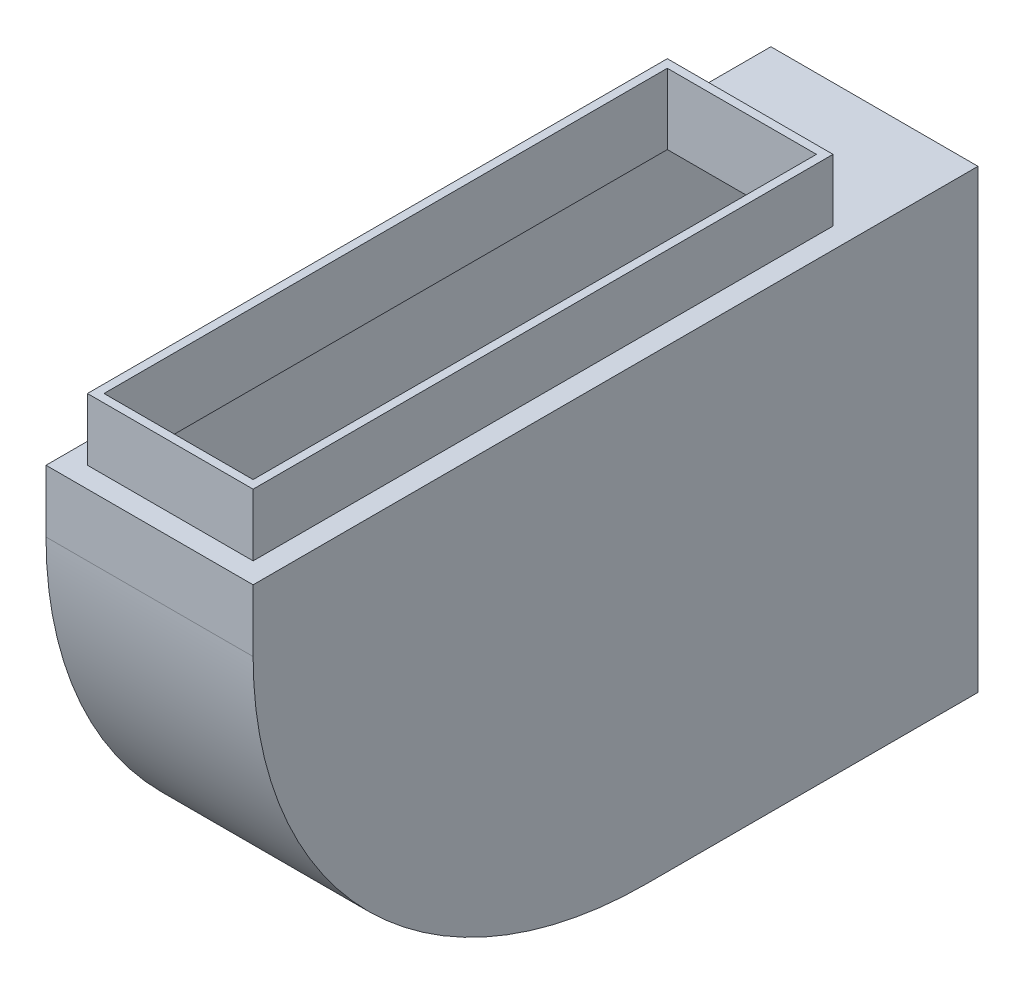
ISO-10303-21;
HEADER;
FILE_DESCRIPTION(('STEP AP214'),'2;1');
FILE_NAME('part.step','',(''),(''),'','','');
FILE_SCHEMA(('AUTOMOTIVE_DESIGN { 1 0 10303 214 1 1 1 1 }'));
ENDSEC;
DATA;
#1=APPLICATION_CONTEXT('core data for automotive mechanical design processes');
#2=APPLICATION_PROTOCOL_DEFINITION('international standard','automotive_design',2000,#1);
#3=PRODUCT_CONTEXT('',#1,'mechanical');
#4=PRODUCT('Part','Part','',(#3));
#5=PRODUCT_RELATED_PRODUCT_CATEGORY('part','',(#4));
#6=PRODUCT_DEFINITION_FORMATION('','',#4);
#7=PRODUCT_DEFINITION_CONTEXT('part definition',#1,'design');
#8=PRODUCT_DEFINITION('design','',#6,#7);
#9=PRODUCT_DEFINITION_SHAPE('','',#8);
#10=(LENGTH_UNIT() NAMED_UNIT(*) SI_UNIT(.MILLI.,.METRE.));
#11=(NAMED_UNIT(*) PLANE_ANGLE_UNIT() SI_UNIT($,.RADIAN.));
#12=(NAMED_UNIT(*) SI_UNIT($,.STERADIAN.) SOLID_ANGLE_UNIT());
#13=UNCERTAINTY_MEASURE_WITH_UNIT(LENGTH_MEASURE(1.E-05),#10,'distance_accuracy_value','');
#14=(GEOMETRIC_REPRESENTATION_CONTEXT(3) GLOBAL_UNCERTAINTY_ASSIGNED_CONTEXT((#13)) GLOBAL_UNIT_ASSIGNED_CONTEXT((#10,
#11,#12)) REPRESENTATION_CONTEXT('',''));
#15=CARTESIAN_POINT('',(0.,0.,0.));
#16=DIRECTION('',(0.,0.,1.));
#17=DIRECTION('',(1.,0.,0.));
#18=AXIS2_PLACEMENT_3D('',#15,#16,#17);
#19=CARTESIAN_POINT('',(0.,3.,0.));
#20=DIRECTION('',(0.,-1.,0.));
#21=DIRECTION('',(0.,0.,-1.));
#22=AXIS2_PLACEMENT_3D('',#19,#20,#21);
#23=PLANE('',#22);
#24=DIRECTION('',(0.,0.,-1.));
#25=VECTOR('',#24,1.);
#26=CARTESIAN_POINT('',(4.,3.,14.));
#27=LINE('',#26,#25);
#28=CARTESIAN_POINT('',(4.,3.,14.));
#29=VERTEX_POINT('',#28);
#30=CARTESIAN_POINT('',(4.,3.,-14.));
#31=VERTEX_POINT('',#30);
#32=EDGE_CURVE('E416',#29,#31,#27,.T.);
#33=ORIENTED_EDGE('',*,*,#32,.T.);
#34=DIRECTION('',(-1.,0.,0.));
#35=VECTOR('',#34,1.);
#36=CARTESIAN_POINT('',(-4.,3.,-14.));
#37=LINE('',#36,#35);
#38=CARTESIAN_POINT('',(-4.,3.,-14.));
#39=VERTEX_POINT('',#38);
#40=EDGE_CURVE('E420',#31,#39,#37,.T.);
#41=ORIENTED_EDGE('',*,*,#40,.T.);
#42=DIRECTION('',(0.,0.,1.));
#43=VECTOR('',#42,1.);
#44=CARTESIAN_POINT('',(-4.,3.,14.));
#45=LINE('',#44,#43);
#46=CARTESIAN_POINT('',(-4.,3.,14.));
#47=VERTEX_POINT('',#46);
#48=EDGE_CURVE('E424',#39,#47,#45,.T.);
#49=ORIENTED_EDGE('',*,*,#48,.T.);
#50=DIRECTION('',(1.,0.,0.));
#51=VECTOR('',#50,1.);
#52=CARTESIAN_POINT('',(-4.,3.,14.));
#53=LINE('',#52,#51);
#54=EDGE_CURVE('E427',#47,#29,#53,.T.);
#55=ORIENTED_EDGE('',*,*,#54,.T.);
#56=EDGE_LOOP('',(#33,#41,#49,#55));
#57=FACE_BOUND('',#56,.T.);
#58=DIRECTION('',(0.,0.,-1.));
#59=VECTOR('',#58,1.);
#60=CARTESIAN_POINT('',(3.6,3.,0.));
#61=LINE('',#60,#59);
#62=CARTESIAN_POINT('',(3.6,3.,13.6));
#63=VERTEX_POINT('',#62);
#64=CARTESIAN_POINT('',(3.6,3.,-13.6));
#65=VERTEX_POINT('',#64);
#66=EDGE_CURVE('E269',#63,#65,#61,.T.);
#67=ORIENTED_EDGE('',*,*,#66,.F.);
#68=DIRECTION('',(1.,0.,0.));
#69=VECTOR('',#68,1.);
#70=CARTESIAN_POINT('',(0.,3.,13.6));
#71=LINE('',#70,#69);
#72=CARTESIAN_POINT('',(-3.6,3.,13.6));
#73=VERTEX_POINT('',#72);
#74=EDGE_CURVE('E287',#73,#63,#71,.T.);
#75=ORIENTED_EDGE('',*,*,#74,.F.);
#76=DIRECTION('',(0.,0.,1.));
#77=VECTOR('',#76,1.);
#78=CARTESIAN_POINT('',(-3.6,3.,0.));
#79=LINE('',#78,#77);
#80=CARTESIAN_POINT('',(-3.6,3.,-13.6));
#81=VERTEX_POINT('',#80);
#82=EDGE_CURVE('E353',#81,#73,#79,.T.);
#83=ORIENTED_EDGE('',*,*,#82,.F.);
#84=DIRECTION('',(-1.,0.,0.));
#85=VECTOR('',#84,1.);
#86=CARTESIAN_POINT('',(0.,3.,-13.6));
#87=LINE('',#86,#85);
#88=EDGE_CURVE('E350',#65,#81,#87,.T.);
#89=ORIENTED_EDGE('',*,*,#88,.F.);
#90=EDGE_LOOP('',(#67,#75,#83,#89));
#91=FACE_BOUND('',#90,.T.);
#92=ADVANCED_FACE('F39',(#57,#91),#23,.F.);
#93=CARTESIAN_POINT('',(-12.5,0.,0.));
#94=DIRECTION('',(1.,0.,0.));
#95=DIRECTION('',(0.,0.,-1.));
#96=AXIS2_PLACEMENT_3D('',#93,#94,#95);
#97=PLANE('',#96);
#98=DIRECTION('',(0.,0.,1.));
#99=VECTOR('',#98,1.);
#100=CARTESIAN_POINT('',(-12.5,-22.,-3.99999999999999));
#101=LINE('',#100,#99);
#102=CARTESIAN_POINT('',(-12.5,-22.,-17.));
#103=VERTEX_POINT('',#102);
#104=CARTESIAN_POINT('',(-12.5,-22.,-6.99999999999999));
#105=VERTEX_POINT('',#104);
#106=EDGE_CURVE('E371',#103,#105,#101,.T.);
#107=ORIENTED_EDGE('',*,*,#106,.T.);
#108=DIRECTION('',(0.,1.,0.));
#109=VECTOR('',#108,1.);
#110=CARTESIAN_POINT('',(-12.5,0.,-6.99999999999999));
#111=LINE('',#110,#109);
#112=CARTESIAN_POINT('',(-12.5,-19.,-6.99999999999999));
#113=VERTEX_POINT('',#112);
#114=EDGE_CURVE('E489',#105,#113,#111,.T.);
#115=ORIENTED_EDGE('',*,*,#114,.T.);
#116=DIRECTION('',(0.,0.,-1.));
#117=VECTOR('',#116,1.);
#118=CARTESIAN_POINT('',(-12.5,-19.,0.));
#119=LINE('',#118,#117);
#120=CARTESIAN_POINT('',(-12.5,-19.,-17.));
#121=VERTEX_POINT('',#120);
#122=EDGE_CURVE('E473',#113,#121,#119,.T.);
#123=ORIENTED_EDGE('',*,*,#122,.T.);
#124=DIRECTION('',(0.,-1.,0.));
#125=VECTOR('',#124,1.);
#126=CARTESIAN_POINT('',(-12.5,-22.,-17.));
#127=LINE('',#126,#125);
#128=EDGE_CURVE('E485',#121,#103,#127,.T.);
#129=ORIENTED_EDGE('',*,*,#128,.T.);
#130=EDGE_LOOP('',(#107,#115,#123,#129));
#131=FACE_BOUND('',#130,.T.);
#132=DIRECTION('',(0.,0.,1.));
#133=VECTOR('',#132,1.);
#134=CARTESIAN_POINT('',(-12.5,-21.6,0.));
#135=LINE('',#134,#133);
#136=CARTESIAN_POINT('',(-12.5,-21.6,-16.5691868154292));
#137=VERTEX_POINT('',#136);
#138=CARTESIAN_POINT('',(-12.5,-21.6,-7.43081318457075));
#139=VERTEX_POINT('',#138);
#140=EDGE_CURVE('E305',#137,#139,#135,.T.);
#141=ORIENTED_EDGE('',*,*,#140,.F.);
#142=DIRECTION('',(0.,-1.,0.));
#143=VECTOR('',#142,1.);
#144=CARTESIAN_POINT('',(-12.5,0.,-16.5691868154292));
#145=LINE('',#144,#143);
#146=CARTESIAN_POINT('',(-12.5,-19.4472135955,-16.5691868154292));
#147=VERTEX_POINT('',#146);
#148=EDGE_CURVE('E365',#147,#137,#145,.T.);
#149=ORIENTED_EDGE('',*,*,#148,.F.);
#150=DIRECTION('',(0.,0.,1.));
#151=VECTOR('',#150,1.);
#152=CARTESIAN_POINT('',(-12.5,-19.4472135955,0.));
#153=LINE('',#152,#151);
#154=CARTESIAN_POINT('',(-12.5,-19.4472135955,-7.43081318457075));
#155=VERTEX_POINT('',#154);
#156=EDGE_CURVE('E63',#155,#147,#153,.F.);
#157=ORIENTED_EDGE('',*,*,#156,.F.);
#158=DIRECTION('',(0.,-1.,0.));
#159=VECTOR('',#158,1.);
#160=CARTESIAN_POINT('',(-12.5,0.,-7.43081318457075));
#161=LINE('',#160,#159);
#162=EDGE_CURVE('E340',#139,#155,#161,.F.);
#163=ORIENTED_EDGE('',*,*,#162,.F.);
#164=EDGE_LOOP('',(#141,#149,#157,#163));
#165=FACE_BOUND('',#164,.T.);
#166=ADVANCED_FACE('F517',(#131,#165),#97,.F.);
#167=CARTESIAN_POINT('',(-5.,-22.,-15.));
#168=DIRECTION('',(1.,0.,0.));
#169=DIRECTION('',(0.,0.,-1.));
#170=AXIS2_PLACEMENT_3D('',#167,#168,#169);
#171=PLANE('',#170);
#172=DIRECTION('',(0.,1.,0.));
#173=VECTOR('',#172,1.);
#174=CARTESIAN_POINT('',(-5.,0.,-20.));
#175=LINE('',#174,#173);
#176=CARTESIAN_POINT('',(-5.,-15.25,-20.));
#177=VERTEX_POINT('',#176);
#178=CARTESIAN_POINT('',(-5.,0.,-20.));
#179=VERTEX_POINT('',#178);
#180=EDGE_CURVE('E386',#177,#179,#175,.T.);
#181=ORIENTED_EDGE('',*,*,#180,.F.);
#182=DIRECTION('',(0.,0.,1.));
#183=VECTOR('',#182,1.);
#184=CARTESIAN_POINT('',(-5.,-15.25,-3.99999999999999));
#185=LINE('',#184,#183);
#186=CARTESIAN_POINT('',(-5.,-15.25,-3.99999999999999));
#187=VERTEX_POINT('',#186);
#188=EDGE_CURVE('E481',#177,#187,#185,.T.);
#189=ORIENTED_EDGE('',*,*,#188,.T.);
#190=DIRECTION('',(0.,1.,0.));
#191=VECTOR('',#190,1.);
#192=CARTESIAN_POINT('',(-5.,-17.,-3.99999999999999));
#193=LINE('',#192,#191);
#194=CARTESIAN_POINT('',(-5.,-22.,-3.99999999999999));
#195=VERTEX_POINT('',#194);
#196=EDGE_CURVE('E347',#195,#187,#193,.T.);
#197=ORIENTED_EDGE('',*,*,#196,.F.);
#198=CARTESIAN_POINT('',(-5.,-3.,-4.));
#199=DIRECTION('',(1.,0.,0.));
#200=DIRECTION('',(0.,0.,-1.));
#201=AXIS2_PLACEMENT_3D('',#198,#199,#200);
#202=CIRCLE('',#201,19.);
#203=CARTESIAN_POINT('',(-5.,-3.,15.));
#204=VERTEX_POINT('',#203);
#205=EDGE_CURVE('E464',#195,#204,#202,.F.);
#206=ORIENTED_EDGE('',*,*,#205,.T.);
#207=DIRECTION('',(0.,1.,0.));
#208=VECTOR('',#207,1.);
#209=CARTESIAN_POINT('',(-5.,-22.,15.));
#210=LINE('',#209,#208);
#211=CARTESIAN_POINT('',(-5.,0.,15.));
#212=VERTEX_POINT('',#211);
#213=EDGE_CURVE('E398',#204,#212,#210,.T.);
#214=ORIENTED_EDGE('',*,*,#213,.T.);
#215=DIRECTION('',(0.,0.,-1.));
#216=VECTOR('',#215,1.);
#217=CARTESIAN_POINT('',(-5.,0.,-15.));
#218=LINE('',#217,#216);
#219=EDGE_CURVE('E399',#212,#179,#218,.T.);
#220=ORIENTED_EDGE('',*,*,#219,.T.);
#221=EDGE_LOOP('',(#181,#189,#197,#206,#214,#220));
#222=FACE_BOUND('',#221,.T.);
#223=ADVANCED_FACE('F548',(#222),#171,.F.);
#224=CARTESIAN_POINT('',(4.,3.,14.));
#225=DIRECTION('',(-1.,0.,0.));
#226=DIRECTION('',(0.,0.,1.));
#227=AXIS2_PLACEMENT_3D('',#224,#225,#226);
#228=PLANE('',#227);
#229=DIRECTION('',(0.,0.,-1.));
#230=VECTOR('',#229,1.);
#231=CARTESIAN_POINT('',(4.,0.,14.));
#232=LINE('',#231,#230);
#233=CARTESIAN_POINT('',(4.,0.,14.));
#234=VERTEX_POINT('',#233);
#235=CARTESIAN_POINT('',(4.,0.,-14.));
#236=VERTEX_POINT('',#235);
#237=EDGE_CURVE('E415',#234,#236,#232,.T.);
#238=ORIENTED_EDGE('',*,*,#237,.T.);
#239=DIRECTION('',(0.,-1.,0.));
#240=VECTOR('',#239,1.);
#241=CARTESIAN_POINT('',(4.,3.,-14.));
#242=LINE('',#241,#240);
#243=EDGE_CURVE('E456',#31,#236,#242,.T.);
#244=ORIENTED_EDGE('',*,*,#243,.F.);
#245=ORIENTED_EDGE('',*,*,#32,.F.);
#246=DIRECTION('',(0.,-1.,0.));
#247=VECTOR('',#246,1.);
#248=CARTESIAN_POINT('',(4.,3.,14.));
#249=LINE('',#248,#247);
#250=EDGE_CURVE('E430',#29,#234,#249,.T.);
#251=ORIENTED_EDGE('',*,*,#250,.T.);
#252=EDGE_LOOP('',(#238,#244,#245,#251));
#253=FACE_BOUND('',#252,.T.);
#254=ADVANCED_FACE('F566',(#253),#228,.F.);
#255=CARTESIAN_POINT('',(-4.,3.,-14.));
#256=DIRECTION('',(0.,0.,1.));
#257=DIRECTION('',(1.,0.,0.));
#258=AXIS2_PLACEMENT_3D('',#255,#256,#257);
#259=PLANE('',#258);
#260=DIRECTION('',(-1.,0.,0.));
#261=VECTOR('',#260,1.);
#262=CARTESIAN_POINT('',(-4.,0.,-14.));
#263=LINE('',#262,#261);
#264=CARTESIAN_POINT('',(-4.,0.,-14.));
#265=VERTEX_POINT('',#264);
#266=EDGE_CURVE('E434',#236,#265,#263,.T.);
#267=ORIENTED_EDGE('',*,*,#266,.T.);
#268=DIRECTION('',(0.,-1.,0.));
#269=VECTOR('',#268,1.);
#270=CARTESIAN_POINT('',(-4.,3.,-14.));
#271=LINE('',#270,#269);
#272=EDGE_CURVE('E452',#39,#265,#271,.T.);
#273=ORIENTED_EDGE('',*,*,#272,.F.);
#274=ORIENTED_EDGE('',*,*,#40,.F.);
#275=ORIENTED_EDGE('',*,*,#243,.T.);
#276=EDGE_LOOP('',(#267,#273,#274,#275));
#277=FACE_BOUND('',#276,.T.);
#278=ADVANCED_FACE('F574',(#277),#259,.F.);
#279=CARTESIAN_POINT('',(-4.,3.,14.));
#280=DIRECTION('',(1.,0.,0.));
#281=DIRECTION('',(0.,0.,-1.));
#282=AXIS2_PLACEMENT_3D('',#279,#280,#281);
#283=PLANE('',#282);
#284=DIRECTION('',(0.,0.,1.));
#285=VECTOR('',#284,1.);
#286=CARTESIAN_POINT('',(-4.,0.,14.));
#287=LINE('',#286,#285);
#288=CARTESIAN_POINT('',(-4.,0.,14.));
#289=VERTEX_POINT('',#288);
#290=EDGE_CURVE('E438',#265,#289,#287,.T.);
#291=ORIENTED_EDGE('',*,*,#290,.T.);
#292=DIRECTION('',(0.,-1.,0.));
#293=VECTOR('',#292,1.);
#294=CARTESIAN_POINT('',(-4.,3.,14.));
#295=LINE('',#294,#293);
#296=EDGE_CURVE('E448',#47,#289,#295,.T.);
#297=ORIENTED_EDGE('',*,*,#296,.F.);
#298=ORIENTED_EDGE('',*,*,#48,.F.);
#299=ORIENTED_EDGE('',*,*,#272,.T.);
#300=EDGE_LOOP('',(#291,#297,#298,#299));
#301=FACE_BOUND('',#300,.T.);
#302=ADVANCED_FACE('F572',(#301),#283,.F.);
#303=CARTESIAN_POINT('',(-4.,3.,14.));
#304=DIRECTION('',(0.,0.,-1.));
#305=DIRECTION('',(-1.,0.,0.));
#306=AXIS2_PLACEMENT_3D('',#303,#304,#305);
#307=PLANE('',#306);
#308=DIRECTION('',(1.,0.,0.));
#309=VECTOR('',#308,1.);
#310=CARTESIAN_POINT('',(-4.,0.,14.));
#311=LINE('',#310,#309);
#312=EDGE_CURVE('E421',#289,#234,#311,.T.);
#313=ORIENTED_EDGE('',*,*,#312,.T.);
#314=ORIENTED_EDGE('',*,*,#250,.F.);
#315=ORIENTED_EDGE('',*,*,#54,.F.);
#316=ORIENTED_EDGE('',*,*,#296,.T.);
#317=EDGE_LOOP('',(#313,#314,#315,#316));
#318=FACE_BOUND('',#317,.T.);
#319=ADVANCED_FACE('F557',(#318),#307,.F.);
#320=CARTESIAN_POINT('',(0.,0.,0.));
#321=DIRECTION('',(0.,1.,0.));
#322=DIRECTION('',(0.,0.,1.));
#323=AXIS2_PLACEMENT_3D('',#320,#321,#322);
#324=PLANE('',#323);
#325=DIRECTION('',(0.,0.,1.));
#326=VECTOR('',#325,1.);
#327=CARTESIAN_POINT('',(5.,0.,-15.));
#328=LINE('',#327,#326);
#329=CARTESIAN_POINT('',(5.,0.,-20.));
#330=VERTEX_POINT('',#329);
#331=CARTESIAN_POINT('',(5.,0.,15.));
#332=VERTEX_POINT('',#331);
#333=EDGE_CURVE('E393',#330,#332,#328,.T.);
#334=ORIENTED_EDGE('',*,*,#333,.F.);
#335=DIRECTION('',(1.,0.,0.));
#336=VECTOR('',#335,1.);
#337=CARTESIAN_POINT('',(5.,0.,-20.));
#338=LINE('',#337,#336);
#339=EDGE_CURVE('E389',#179,#330,#338,.T.);
#340=ORIENTED_EDGE('',*,*,#339,.F.);
#341=ORIENTED_EDGE('',*,*,#219,.F.);
#342=DIRECTION('',(-1.,0.,0.));
#343=VECTOR('',#342,1.);
#344=CARTESIAN_POINT('',(-5.,0.,15.));
#345=LINE('',#344,#343);
#346=EDGE_CURVE('E403',#332,#212,#345,.T.);
#347=ORIENTED_EDGE('',*,*,#346,.F.);
#348=EDGE_LOOP('',(#334,#340,#341,#347));
#349=FACE_BOUND('',#348,.T.);
#350=ORIENTED_EDGE('',*,*,#237,.F.);
#351=ORIENTED_EDGE('',*,*,#312,.F.);
#352=ORIENTED_EDGE('',*,*,#290,.F.);
#353=ORIENTED_EDGE('',*,*,#266,.F.);
#354=EDGE_LOOP('',(#350,#351,#352,#353));
#355=FACE_BOUND('',#354,.T.);
#356=ADVANCED_FACE('F554',(#349,#355),#324,.T.);
#357=CARTESIAN_POINT('',(5.,-22.,-15.));
#358=DIRECTION('',(-1.,0.,0.));
#359=DIRECTION('',(0.,0.,1.));
#360=AXIS2_PLACEMENT_3D('',#357,#358,#359);
#361=PLANE('',#360);
#362=DIRECTION('',(0.,1.,0.));
#363=VECTOR('',#362,1.);
#364=CARTESIAN_POINT('',(5.,-22.,15.));
#365=LINE('',#364,#363);
#366=CARTESIAN_POINT('',(5.,-3.,15.));
#367=VERTEX_POINT('',#366);
#368=EDGE_CURVE('E412',#367,#332,#365,.T.);
#369=ORIENTED_EDGE('',*,*,#368,.F.);
#370=CARTESIAN_POINT('',(5.,-3.,-4.));
#371=DIRECTION('',(-1.,0.,0.));
#372=DIRECTION('',(0.,0.,1.));
#373=AXIS2_PLACEMENT_3D('',#370,#371,#372);
#374=CIRCLE('',#373,19.);
#375=CARTESIAN_POINT('',(5.,-22.,-4.));
#376=VERTEX_POINT('',#375);
#377=EDGE_CURVE('E470',#367,#376,#374,.F.);
#378=ORIENTED_EDGE('',*,*,#377,.T.);
#379=DIRECTION('',(0.,0.,1.));
#380=VECTOR('',#379,1.);
#381=CARTESIAN_POINT('',(5.,-22.,-15.));
#382=LINE('',#381,#380);
#383=CARTESIAN_POINT('',(5.,-22.,-20.));
#384=VERTEX_POINT('',#383);
#385=EDGE_CURVE('E394',#384,#376,#382,.T.);
#386=ORIENTED_EDGE('',*,*,#385,.F.);
#387=DIRECTION('',(0.,-1.,0.));
#388=VECTOR('',#387,1.);
#389=CARTESIAN_POINT('',(5.,0.,-20.));
#390=LINE('',#389,#388);
#391=EDGE_CURVE('E375',#330,#384,#390,.T.);
#392=ORIENTED_EDGE('',*,*,#391,.F.);
#393=ORIENTED_EDGE('',*,*,#333,.T.);
#394=EDGE_LOOP('',(#369,#378,#386,#392,#393));
#395=FACE_BOUND('',#394,.T.);
#396=ADVANCED_FACE('F541',(#395),#361,.F.);
#397=CARTESIAN_POINT('',(-5.,-22.,15.));
#398=DIRECTION('',(0.,0.,-1.));
#399=DIRECTION('',(-1.,0.,0.));
#400=AXIS2_PLACEMENT_3D('',#397,#398,#399);
#401=PLANE('',#400);
#402=ORIENTED_EDGE('',*,*,#213,.F.);
#403=DIRECTION('',(-1.,0.,0.));
#404=VECTOR('',#403,1.);
#405=CARTESIAN_POINT('',(-5.,-3.,15.));
#406=LINE('',#405,#404);
#407=EDGE_CURVE('E467',#204,#367,#406,.F.);
#408=ORIENTED_EDGE('',*,*,#407,.T.);
#409=ORIENTED_EDGE('',*,*,#368,.T.);
#410=ORIENTED_EDGE('',*,*,#346,.T.);
#411=EDGE_LOOP('',(#402,#408,#409,#410));
#412=FACE_BOUND('',#411,.T.);
#413=ADVANCED_FACE('F550',(#412),#401,.F.);
#414=CARTESIAN_POINT('',(0.,-22.,0.));
#415=DIRECTION('',(0.,1.,0.));
#416=DIRECTION('',(0.,0.,1.));
#417=AXIS2_PLACEMENT_3D('',#414,#415,#416);
#418=PLANE('',#417);
#419=DIRECTION('',(-1.,0.,0.));
#420=VECTOR('',#419,1.);
#421=CARTESIAN_POINT('',(0.,-22.,-4.));
#422=LINE('',#421,#420);
#423=EDGE_CURVE('E460',#376,#195,#422,.T.);
#424=ORIENTED_EDGE('',*,*,#423,.T.);
#425=DIRECTION('',(0.92847669088526,0.,0.371390676354101));
#426=VECTOR('',#425,1.);
#427=CARTESIAN_POINT('',(-12.5,-22.,-6.99999999999999));
#428=LINE('',#427,#426);
#429=EDGE_CURVE('E48',#195,#105,#428,.F.);
#430=ORIENTED_EDGE('',*,*,#429,.T.);
#431=ORIENTED_EDGE('',*,*,#106,.F.);
#432=DIRECTION('',(0.92847669088526,0.,-0.371390676354101));
#433=VECTOR('',#432,1.);
#434=CARTESIAN_POINT('',(-12.5,-22.,-17.));
#435=LINE('',#434,#433);
#436=CARTESIAN_POINT('',(-4.99999999999994,-22.,-20.));
#437=VERTEX_POINT('',#436);
#438=EDGE_CURVE('E505',#103,#437,#435,.T.);
#439=ORIENTED_EDGE('',*,*,#438,.T.);
#440=DIRECTION('',(-1.,0.,0.));
#441=VECTOR('',#440,1.);
#442=CARTESIAN_POINT('',(5.,-22.,-20.));
#443=LINE('',#442,#441);
#444=EDGE_CURVE('E382',#384,#437,#443,.T.);
#445=ORIENTED_EDGE('',*,*,#444,.F.);
#446=ORIENTED_EDGE('',*,*,#385,.T.);
#447=EDGE_LOOP('',(#424,#430,#431,#439,#445,#446));
#448=FACE_BOUND('',#447,.T.);
#449=ADVANCED_FACE('F511',(#448),#418,.F.);
#450=CARTESIAN_POINT('',(0.,0.,-20.));
#451=DIRECTION('',(0.,0.,-1.));
#452=DIRECTION('',(-1.,0.,0.));
#453=AXIS2_PLACEMENT_3D('',#450,#451,#452);
#454=PLANE('',#453);
#455=ORIENTED_EDGE('',*,*,#444,.T.);
#456=DIRECTION('',(0.,1.,0.));
#457=VECTOR('',#456,1.);
#458=CARTESIAN_POINT('',(-4.99999999999994,-19.,-20.));
#459=LINE('',#458,#457);
#460=EDGE_CURVE('E11',#437,#177,#459,.T.);
#461=ORIENTED_EDGE('',*,*,#460,.T.);
#462=ORIENTED_EDGE('',*,*,#180,.T.);
#463=ORIENTED_EDGE('',*,*,#339,.T.);
#464=ORIENTED_EDGE('',*,*,#391,.T.);
#465=EDGE_LOOP('',(#455,#461,#462,#463,#464));
#466=FACE_BOUND('',#465,.T.);
#467=ADVANCED_FACE('F535',(#466),#454,.T.);
#468=CARTESIAN_POINT('',(0.,-3.,-4.));
#469=DIRECTION('',(-1.,0.,0.));
#470=DIRECTION('',(0.,0.,1.));
#471=AXIS2_PLACEMENT_3D('',#468,#469,#470);
#472=CYLINDRICAL_SURFACE('',#471,19.);
#473=ORIENTED_EDGE('',*,*,#377,.F.);
#474=ORIENTED_EDGE('',*,*,#407,.F.);
#475=ORIENTED_EDGE('',*,*,#205,.F.);
#476=ORIENTED_EDGE('',*,*,#423,.F.);
#477=EDGE_LOOP('',(#473,#474,#475,#476));
#478=FACE_BOUND('',#477,.T.);
#479=ADVANCED_FACE('F544',(#478),#472,.T.);
#480=CARTESIAN_POINT('',(-12.5,-19.,0.));
#481=DIRECTION('',(0.447213595499956,-0.894427190999917,0.));
#482=DIRECTION('',(0.,0.,-1.));
#483=AXIS2_PLACEMENT_3D('',#480,#481,#482);
#484=PLANE('',#483);
#485=ORIENTED_EDGE('',*,*,#122,.F.);
#486=DIRECTION('',(0.84215192106652,0.421075960533258,0.336860768426606));
#487=VECTOR('',#486,1.);
#488=CARTESIAN_POINT('',(-10.5141843971631,-18.0070921985816,-6.20567375886525));
#489=LINE('',#488,#487);
#490=CARTESIAN_POINT('',(-8.49999999999998,-17.,-5.4));
#491=VERTEX_POINT('',#490);
#492=EDGE_CURVE('E496',#113,#491,#489,.T.);
#493=ORIENTED_EDGE('',*,*,#492,.T.);
#494=DIRECTION('',(0.,0.,1.));
#495=VECTOR('',#494,1.);
#496=CARTESIAN_POINT('',(-8.49999999999998,-17.,-3.99999999999999));
#497=LINE('',#496,#495);
#498=CARTESIAN_POINT('',(-8.49999999999998,-17.,-18.6));
#499=VERTEX_POINT('',#498);
#500=EDGE_CURVE('E477',#499,#491,#497,.T.);
#501=ORIENTED_EDGE('',*,*,#500,.F.);
#502=DIRECTION('',(0.84215192106652,0.421075960533258,-0.336860768426605));
#503=VECTOR('',#502,1.);
#504=CARTESIAN_POINT('',(-17.322695035461,-21.4113475177305,-15.0709219858156));
#505=LINE('',#504,#503);
#506=EDGE_CURVE('E493',#499,#121,#505,.F.);
#507=ORIENTED_EDGE('',*,*,#506,.T.);
#508=EDGE_LOOP('',(#485,#493,#501,#507));
#509=FACE_BOUND('',#508,.T.);
#510=ADVANCED_FACE('F525',(#509),#484,.F.);
#511=CARTESIAN_POINT('',(-8.49999999999997,-17.,-3.99999999999999));
#512=DIRECTION('',(-0.44721359549996,0.894427190999915,0.));
#513=DIRECTION('',(0.,0.,1.));
#514=AXIS2_PLACEMENT_3D('',#511,#512,#513);
#515=PLANE('',#514);
#516=ORIENTED_EDGE('',*,*,#500,.T.);
#517=DIRECTION('',(0.842151921066519,0.421075960533262,0.336860768426605));
#518=VECTOR('',#517,1.);
#519=CARTESIAN_POINT('',(-5.76241134751768,-15.6312056737588,-4.30496453900709));
#520=LINE('',#519,#518);
#521=EDGE_CURVE('E502',#491,#187,#520,.T.);
#522=ORIENTED_EDGE('',*,*,#521,.T.);
#523=ORIENTED_EDGE('',*,*,#188,.F.);
#524=DIRECTION('',(0.842151921066519,0.421075960533262,-0.336860768426605));
#525=VECTOR('',#524,1.);
#526=CARTESIAN_POINT('',(-5.76241134751768,-15.6312056737589,-19.6950354609929));
#527=LINE('',#526,#525);
#528=EDGE_CURVE('E499',#177,#499,#527,.F.);
#529=ORIENTED_EDGE('',*,*,#528,.T.);
#530=EDGE_LOOP('',(#516,#522,#523,#529));
#531=FACE_BOUND('',#530,.T.);
#532=ADVANCED_FACE('F528',(#531),#515,.T.);
#533=CARTESIAN_POINT('',(-12.5,0.,-6.99999999999999));
#534=DIRECTION('',(0.371390676354101,0.,-0.92847669088526));
#535=DIRECTION('',(0.,1.,0.));
#536=AXIS2_PLACEMENT_3D('',#533,#534,#535);
#537=PLANE('',#536);
#538=ORIENTED_EDGE('',*,*,#429,.F.);
#539=ORIENTED_EDGE('',*,*,#196,.T.);
#540=ORIENTED_EDGE('',*,*,#521,.F.);
#541=ORIENTED_EDGE('',*,*,#492,.F.);
#542=ORIENTED_EDGE('',*,*,#114,.F.);
#543=EDGE_LOOP('',(#538,#539,#540,#541,#542));
#544=FACE_BOUND('',#543,.T.);
#545=ADVANCED_FACE('F521',(#544),#537,.F.);
#546=CARTESIAN_POINT('',(-12.5,0.,-17.));
#547=DIRECTION('',(-0.371390676354101,0.,-0.928476690885261));
#548=DIRECTION('',(0.,1.,0.));
#549=AXIS2_PLACEMENT_3D('',#546,#547,#548);
#550=PLANE('',#549);
#551=ORIENTED_EDGE('',*,*,#528,.F.);
#552=ORIENTED_EDGE('',*,*,#460,.F.);
#553=ORIENTED_EDGE('',*,*,#438,.F.);
#554=ORIENTED_EDGE('',*,*,#128,.F.);
#555=ORIENTED_EDGE('',*,*,#506,.F.);
#556=EDGE_LOOP('',(#551,#552,#553,#554,#555));
#557=FACE_BOUND('',#556,.T.);
#558=ADVANCED_FACE('F41',(#557),#550,.T.);
#559=CARTESIAN_POINT('',(-4.6,-22.,-15.));
#560=DIRECTION('',(1.,0.,0.));
#561=DIRECTION('',(0.,0.,-1.));
#562=AXIS2_PLACEMENT_3D('',#559,#560,#561);
#563=PLANE('',#562);
#564=DIRECTION('',(0.,1.,0.));
#565=VECTOR('',#564,1.);
#566=CARTESIAN_POINT('',(-4.6,-22.,-19.6));
#567=LINE('',#566,#565);
#568=CARTESIAN_POINT('',(-4.6,-15.4972135955,-19.6));
#569=VERTEX_POINT('',#568);
#570=CARTESIAN_POINT('',(-4.6,-0.4,-19.6));
#571=VERTEX_POINT('',#570);
#572=EDGE_CURVE('E220',#569,#571,#567,.T.);
#573=ORIENTED_EDGE('',*,*,#572,.T.);
#574=DIRECTION('',(0.,0.,-1.));
#575=VECTOR('',#574,1.);
#576=CARTESIAN_POINT('',(-4.6,-0.4,0.));
#577=LINE('',#576,#575);
#578=CARTESIAN_POINT('',(-4.6,-0.4,14.6));
#579=VERTEX_POINT('',#578);
#580=EDGE_CURVE('E224',#579,#571,#577,.T.);
#581=ORIENTED_EDGE('',*,*,#580,.F.);
#582=DIRECTION('',(0.,1.,0.));
#583=VECTOR('',#582,1.);
#584=CARTESIAN_POINT('',(-4.6,-22.,14.6));
#585=LINE('',#584,#583);
#586=CARTESIAN_POINT('',(-4.6,-3.,14.6));
#587=VERTEX_POINT('',#586);
#588=EDGE_CURVE('E295',#587,#579,#585,.T.);
#589=ORIENTED_EDGE('',*,*,#588,.F.);
#590=CARTESIAN_POINT('',(-4.6,-3.,-4.));
#591=DIRECTION('',(1.,0.,0.));
#592=DIRECTION('',(0.,0.,-1.));
#593=AXIS2_PLACEMENT_3D('',#590,#591,#592);
#594=CIRCLE('',#593,18.6);
#595=CARTESIAN_POINT('',(-4.6,-21.6,-4.));
#596=VERTEX_POINT('',#595);
#597=EDGE_CURVE('E308',#596,#587,#594,.F.);
#598=ORIENTED_EDGE('',*,*,#597,.F.);
#599=DIRECTION('',(0.,0.,1.));
#600=VECTOR('',#599,1.);
#601=CARTESIAN_POINT('',(-4.6,-21.6,-15.));
#602=LINE('',#601,#600);
#603=CARTESIAN_POINT('',(-4.6,-21.6,-4.27081318457078));
#604=VERTEX_POINT('',#603);
#605=EDGE_CURVE('E324',#604,#596,#602,.T.);
#606=ORIENTED_EDGE('',*,*,#605,.F.);
#607=DIRECTION('',(0.,-1.,0.));
#608=VECTOR('',#607,1.);
#609=CARTESIAN_POINT('',(-4.6,0.,-4.27081318457078));
#610=LINE('',#609,#608);
#611=CARTESIAN_POINT('',(-4.6,-15.4972135955,-4.27081318457078));
#612=VERTEX_POINT('',#611);
#613=EDGE_CURVE('E361',#604,#612,#610,.F.);
#614=ORIENTED_EDGE('',*,*,#613,.T.);
#615=DIRECTION('',(0.,0.,-1.));
#616=VECTOR('',#615,1.);
#617=CARTESIAN_POINT('',(-4.6,-15.4972135955,-3.99999999999999));
#618=LINE('',#617,#616);
#619=EDGE_CURVE('E227',#569,#612,#618,.F.);
#620=ORIENTED_EDGE('',*,*,#619,.F.);
#621=EDGE_LOOP('',(#573,#581,#589,#598,#606,#614,#620));
#622=FACE_BOUND('',#621,.T.);
#623=ADVANCED_FACE('F222',(#622),#563,.T.);
#624=CARTESIAN_POINT('',(3.6,3.,14.));
#625=DIRECTION('',(-1.,0.,0.));
#626=DIRECTION('',(0.,0.,1.));
#627=AXIS2_PLACEMENT_3D('',#624,#625,#626);
#628=PLANE('',#627);
#629=DIRECTION('',(0.,0.,-1.));
#630=VECTOR('',#629,1.);
#631=CARTESIAN_POINT('',(3.6,-0.4,14.));
#632=LINE('',#631,#630);
#633=CARTESIAN_POINT('',(3.6,-0.4,13.6));
#634=VERTEX_POINT('',#633);
#635=CARTESIAN_POINT('',(3.6,-0.4,-13.6));
#636=VERTEX_POINT('',#635);
#637=EDGE_CURVE('E259',#634,#636,#632,.T.);
#638=ORIENTED_EDGE('',*,*,#637,.F.);
#639=DIRECTION('',(0.,-1.,0.));
#640=VECTOR('',#639,1.);
#641=CARTESIAN_POINT('',(3.6,3.,13.6));
#642=LINE('',#641,#640);
#643=EDGE_CURVE('E283',#63,#634,#642,.T.);
#644=ORIENTED_EDGE('',*,*,#643,.F.);
#645=ORIENTED_EDGE('',*,*,#66,.T.);
#646=DIRECTION('',(0.,-1.,0.));
#647=VECTOR('',#646,1.);
#648=CARTESIAN_POINT('',(3.6,3.,-13.6));
#649=LINE('',#648,#647);
#650=EDGE_CURVE('E277',#65,#636,#649,.T.);
#651=ORIENTED_EDGE('',*,*,#650,.T.);
#652=EDGE_LOOP('',(#638,#644,#645,#651));
#653=FACE_BOUND('',#652,.T.);
#654=ADVANCED_FACE('F658',(#653),#628,.T.);
#655=CARTESIAN_POINT('',(-4.,3.,-13.6));
#656=DIRECTION('',(0.,0.,1.));
#657=DIRECTION('',(1.,0.,0.));
#658=AXIS2_PLACEMENT_3D('',#655,#656,#657);
#659=PLANE('',#658);
#660=DIRECTION('',(-1.,0.,0.));
#661=VECTOR('',#660,1.);
#662=CARTESIAN_POINT('',(-4.,-0.4,-13.6));
#663=LINE('',#662,#661);
#664=CARTESIAN_POINT('',(-3.6,-0.4,-13.6));
#665=VERTEX_POINT('',#664);
#666=EDGE_CURVE('E263',#636,#665,#663,.T.);
#667=ORIENTED_EDGE('',*,*,#666,.F.);
#668=ORIENTED_EDGE('',*,*,#650,.F.);
#669=ORIENTED_EDGE('',*,*,#88,.T.);
#670=DIRECTION('',(0.,-1.,0.));
#671=VECTOR('',#670,1.);
#672=CARTESIAN_POINT('',(-3.6,3.,-13.6));
#673=LINE('',#672,#671);
#674=EDGE_CURVE('E282',#81,#665,#673,.T.);
#675=ORIENTED_EDGE('',*,*,#674,.T.);
#676=EDGE_LOOP('',(#667,#668,#669,#675));
#677=FACE_BOUND('',#676,.T.);
#678=ADVANCED_FACE('F666',(#677),#659,.T.);
#679=CARTESIAN_POINT('',(-3.6,3.,14.));
#680=DIRECTION('',(1.,0.,0.));
#681=DIRECTION('',(0.,0.,-1.));
#682=AXIS2_PLACEMENT_3D('',#679,#680,#681);
#683=PLANE('',#682);
#684=DIRECTION('',(0.,0.,1.));
#685=VECTOR('',#684,1.);
#686=CARTESIAN_POINT('',(-3.6,-0.4,14.));
#687=LINE('',#686,#685);
#688=CARTESIAN_POINT('',(-3.6,-0.4,13.6));
#689=VERTEX_POINT('',#688);
#690=EDGE_CURVE('E270',#665,#689,#687,.T.);
#691=ORIENTED_EDGE('',*,*,#690,.F.);
#692=ORIENTED_EDGE('',*,*,#674,.F.);
#693=ORIENTED_EDGE('',*,*,#82,.T.);
#694=DIRECTION('',(0.,-1.,0.));
#695=VECTOR('',#694,1.);
#696=CARTESIAN_POINT('',(-3.6,3.,13.6));
#697=LINE('',#696,#695);
#698=EDGE_CURVE('E55',#73,#689,#697,.T.);
#699=ORIENTED_EDGE('',*,*,#698,.T.);
#700=EDGE_LOOP('',(#691,#692,#693,#699));
#701=FACE_BOUND('',#700,.T.);
#702=ADVANCED_FACE('F674',(#701),#683,.T.);
#703=CARTESIAN_POINT('',(-4.,3.,13.6));
#704=DIRECTION('',(0.,0.,-1.));
#705=DIRECTION('',(-1.,0.,0.));
#706=AXIS2_PLACEMENT_3D('',#703,#704,#705);
#707=PLANE('',#706);
#708=DIRECTION('',(1.,0.,0.));
#709=VECTOR('',#708,1.);
#710=CARTESIAN_POINT('',(-4.,-0.4,13.6));
#711=LINE('',#710,#709);
#712=EDGE_CURVE('E265',#689,#634,#711,.T.);
#713=ORIENTED_EDGE('',*,*,#712,.F.);
#714=ORIENTED_EDGE('',*,*,#698,.F.);
#715=ORIENTED_EDGE('',*,*,#74,.T.);
#716=ORIENTED_EDGE('',*,*,#643,.T.);
#717=EDGE_LOOP('',(#713,#714,#715,#716));
#718=FACE_BOUND('',#717,.T.);
#719=ADVANCED_FACE('F682',(#718),#707,.T.);
#720=CARTESIAN_POINT('',(0.,-0.4,0.));
#721=DIRECTION('',(0.,1.,0.));
#722=DIRECTION('',(0.,0.,1.));
#723=AXIS2_PLACEMENT_3D('',#720,#721,#722);
#724=PLANE('',#723);
#725=DIRECTION('',(0.,0.,1.));
#726=VECTOR('',#725,1.);
#727=CARTESIAN_POINT('',(4.6,-0.4,0.));
#728=LINE('',#727,#726);
#729=CARTESIAN_POINT('',(4.6,-0.4,-19.6));
#730=VERTEX_POINT('',#729);
#731=CARTESIAN_POINT('',(4.6,-0.4,14.6));
#732=VERTEX_POINT('',#731);
#733=EDGE_CURVE('E252',#730,#732,#728,.T.);
#734=ORIENTED_EDGE('',*,*,#733,.T.);
#735=DIRECTION('',(-1.,0.,0.));
#736=VECTOR('',#735,1.);
#737=CARTESIAN_POINT('',(0.,-0.4,14.6));
#738=LINE('',#737,#736);
#739=EDGE_CURVE('E243',#732,#579,#738,.T.);
#740=ORIENTED_EDGE('',*,*,#739,.T.);
#741=ORIENTED_EDGE('',*,*,#580,.T.);
#742=DIRECTION('',(1.,0.,0.));
#743=VECTOR('',#742,1.);
#744=CARTESIAN_POINT('',(0.,-0.4,-19.6));
#745=LINE('',#744,#743);
#746=EDGE_CURVE('E232',#571,#730,#745,.T.);
#747=ORIENTED_EDGE('',*,*,#746,.T.);
#748=EDGE_LOOP('',(#734,#740,#741,#747));
#749=FACE_BOUND('',#748,.T.);
#750=ORIENTED_EDGE('',*,*,#637,.T.);
#751=ORIENTED_EDGE('',*,*,#666,.T.);
#752=ORIENTED_EDGE('',*,*,#690,.T.);
#753=ORIENTED_EDGE('',*,*,#712,.T.);
#754=EDGE_LOOP('',(#750,#751,#752,#753));
#755=FACE_BOUND('',#754,.T.);
#756=ADVANCED_FACE('F239',(#749,#755),#724,.F.);
#757=CARTESIAN_POINT('',(4.6,-22.,-15.));
#758=DIRECTION('',(-1.,0.,0.));
#759=DIRECTION('',(0.,0.,1.));
#760=AXIS2_PLACEMENT_3D('',#757,#758,#759);
#761=PLANE('',#760);
#762=DIRECTION('',(0.,1.,0.));
#763=VECTOR('',#762,1.);
#764=CARTESIAN_POINT('',(4.6,-22.,14.6));
#765=LINE('',#764,#763);
#766=CARTESIAN_POINT('',(4.6,-3.,14.6));
#767=VERTEX_POINT('',#766);
#768=EDGE_CURVE('E264',#767,#732,#765,.T.);
#769=ORIENTED_EDGE('',*,*,#768,.T.);
#770=ORIENTED_EDGE('',*,*,#733,.F.);
#771=DIRECTION('',(0.,-1.,0.));
#772=VECTOR('',#771,1.);
#773=CARTESIAN_POINT('',(4.6,-22.,-19.6));
#774=LINE('',#773,#772);
#775=CARTESIAN_POINT('',(4.6,-21.6,-19.6));
#776=VERTEX_POINT('',#775);
#777=EDGE_CURVE('E250',#730,#776,#774,.T.);
#778=ORIENTED_EDGE('',*,*,#777,.T.);
#779=DIRECTION('',(0.,0.,1.));
#780=VECTOR('',#779,1.);
#781=CARTESIAN_POINT('',(4.6,-21.6,0.));
#782=LINE('',#781,#780);
#783=CARTESIAN_POINT('',(4.6,-21.6,-4.));
#784=VERTEX_POINT('',#783);
#785=EDGE_CURVE('E245',#776,#784,#782,.T.);
#786=ORIENTED_EDGE('',*,*,#785,.T.);
#787=CARTESIAN_POINT('',(4.6,-3.,-4.));
#788=DIRECTION('',(-1.,0.,0.));
#789=DIRECTION('',(0.,0.,1.));
#790=AXIS2_PLACEMENT_3D('',#787,#788,#789);
#791=CIRCLE('',#790,18.6);
#792=EDGE_CURVE('E296',#767,#784,#791,.F.);
#793=ORIENTED_EDGE('',*,*,#792,.F.);
#794=EDGE_LOOP('',(#769,#770,#778,#786,#793));
#795=FACE_BOUND('',#794,.T.);
#796=ADVANCED_FACE('F696',(#795),#761,.T.);
#797=CARTESIAN_POINT('',(-5.,-22.,14.6));
#798=DIRECTION('',(0.,0.,-1.));
#799=DIRECTION('',(-1.,0.,0.));
#800=AXIS2_PLACEMENT_3D('',#797,#798,#799);
#801=PLANE('',#800);
#802=ORIENTED_EDGE('',*,*,#588,.T.);
#803=ORIENTED_EDGE('',*,*,#739,.F.);
#804=ORIENTED_EDGE('',*,*,#768,.F.);
#805=DIRECTION('',(-1.,0.,0.));
#806=VECTOR('',#805,1.);
#807=CARTESIAN_POINT('',(-5.,-3.,14.6));
#808=LINE('',#807,#806);
#809=EDGE_CURVE('E299',#587,#767,#808,.F.);
#810=ORIENTED_EDGE('',*,*,#809,.F.);
#811=EDGE_LOOP('',(#802,#803,#804,#810));
#812=FACE_BOUND('',#811,.T.);
#813=ADVANCED_FACE('F703',(#812),#801,.T.);
#814=CARTESIAN_POINT('',(0.,-21.6,0.));
#815=DIRECTION('',(0.,1.,0.));
#816=DIRECTION('',(0.,0.,1.));
#817=AXIS2_PLACEMENT_3D('',#814,#815,#816);
#818=PLANE('',#817);
#819=DIRECTION('',(1.,0.,0.));
#820=VECTOR('',#819,1.);
#821=CARTESIAN_POINT('',(0.,-21.6,-4.));
#822=LINE('',#821,#820);
#823=EDGE_CURVE('E281',#784,#596,#822,.F.);
#824=ORIENTED_EDGE('',*,*,#823,.F.);
#825=ORIENTED_EDGE('',*,*,#785,.F.);
#826=DIRECTION('',(-1.,0.,0.));
#827=VECTOR('',#826,1.);
#828=CARTESIAN_POINT('',(0.,-21.6,-19.6));
#829=LINE('',#828,#827);
#830=CARTESIAN_POINT('',(-4.92296703857304,-21.6,-19.6));
#831=VERTEX_POINT('',#830);
#832=EDGE_CURVE('E233',#776,#831,#829,.T.);
#833=ORIENTED_EDGE('',*,*,#832,.T.);
#834=DIRECTION('',(0.92847669088526,0.,-0.371390676354101));
#835=VECTOR('',#834,1.);
#836=CARTESIAN_POINT('',(-12.3514437294584,-21.6,-16.6286093236459));
#837=LINE('',#836,#835);
#838=EDGE_CURVE('E315',#137,#831,#837,.T.);
#839=ORIENTED_EDGE('',*,*,#838,.F.);
#840=ORIENTED_EDGE('',*,*,#140,.T.);
#841=DIRECTION('',(0.92847669088526,0.,0.371390676354101));
#842=VECTOR('',#841,1.);
#843=CARTESIAN_POINT('',(-12.3514437294584,-21.6,-7.3713906763541));
#844=LINE('',#843,#842);
#845=EDGE_CURVE('E311',#604,#139,#844,.F.);
#846=ORIENTED_EDGE('',*,*,#845,.F.);
#847=ORIENTED_EDGE('',*,*,#605,.T.);
#848=EDGE_LOOP('',(#824,#825,#833,#839,#840,#846,#847));
#849=FACE_BOUND('',#848,.T.);
#850=ADVANCED_FACE('F711',(#849),#818,.T.);
#851=CARTESIAN_POINT('',(0.,0.,-19.6));
#852=DIRECTION('',(0.,0.,-1.));
#853=DIRECTION('',(-1.,0.,0.));
#854=AXIS2_PLACEMENT_3D('',#851,#852,#853);
#855=PLANE('',#854);
#856=ORIENTED_EDGE('',*,*,#832,.F.);
#857=ORIENTED_EDGE('',*,*,#777,.F.);
#858=ORIENTED_EDGE('',*,*,#746,.F.);
#859=ORIENTED_EDGE('',*,*,#572,.F.);
#860=DIRECTION('',(0.894427190999915,0.44721359549996,0.));
#861=VECTOR('',#860,1.);
#862=CARTESIAN_POINT('',(5.2788854382,-10.5577708763999,-19.6));
#863=LINE('',#862,#861);
#864=CARTESIAN_POINT('',(-4.92296703857304,-15.6586971147865,-19.6));
#865=VERTEX_POINT('',#864);
#866=EDGE_CURVE('E344',#569,#865,#863,.F.);
#867=ORIENTED_EDGE('',*,*,#866,.T.);
#868=DIRECTION('',(0.,1.,0.));
#869=VECTOR('',#868,1.);
#870=CARTESIAN_POINT('',(-4.92296703857304,0.,-19.6));
#871=LINE('',#870,#869);
#872=EDGE_CURVE('E314',#831,#865,#871,.T.);
#873=ORIENTED_EDGE('',*,*,#872,.F.);
#874=EDGE_LOOP('',(#856,#857,#858,#859,#867,#873));
#875=FACE_BOUND('',#874,.T.);
#876=ADVANCED_FACE('F248',(#875),#855,.F.);
#877=CARTESIAN_POINT('',(0.,-3.,-4.));
#878=DIRECTION('',(-1.,0.,0.));
#879=DIRECTION('',(0.,0.,1.));
#880=AXIS2_PLACEMENT_3D('',#877,#878,#879);
#881=CYLINDRICAL_SURFACE('',#880,18.6);
#882=ORIENTED_EDGE('',*,*,#792,.T.);
#883=ORIENTED_EDGE('',*,*,#823,.T.);
#884=ORIENTED_EDGE('',*,*,#597,.T.);
#885=ORIENTED_EDGE('',*,*,#809,.T.);
#886=EDGE_LOOP('',(#882,#883,#884,#885));
#887=FACE_BOUND('',#886,.T.);
#888=ADVANCED_FACE('F726',(#887),#881,.F.);
#889=CARTESIAN_POINT('',(-12.3211145618,-19.3577708764,0.));
#890=DIRECTION('',(0.447213595499956,-0.894427190999917,0.));
#891=DIRECTION('',(0.,0.,-1.));
#892=AXIS2_PLACEMENT_3D('',#889,#890,#891);
#893=PLANE('',#892);
#894=ORIENTED_EDGE('',*,*,#156,.T.);
#895=DIRECTION('',(0.84215192106652,0.421075960533258,-0.336860768426605));
#896=VECTOR('',#895,1.);
#897=CARTESIAN_POINT('',(-17.0418921478168,-21.7181596694084,-14.7524299563025));
#898=LINE('',#897,#896);
#899=CARTESIAN_POINT('',(-8.32111456179999,-17.3577708764,-18.2407409907092));
#900=VERTEX_POINT('',#899);
#901=EDGE_CURVE('E337',#900,#147,#898,.F.);
#902=ORIENTED_EDGE('',*,*,#901,.F.);
#903=DIRECTION('',(0.,0.,1.));
#904=VECTOR('',#903,1.);
#905=CARTESIAN_POINT('',(-8.32111456179999,-17.3577708764,-3.99999999999999));
#906=LINE('',#905,#904);
#907=CARTESIAN_POINT('',(-8.32111456179999,-17.3577708764,-5.75925900929076));
#908=VERTEX_POINT('',#907);
#909=EDGE_CURVE('E325',#900,#908,#906,.T.);
#910=ORIENTED_EDGE('',*,*,#909,.T.);
#911=DIRECTION('',(0.84215192106652,0.421075960533258,0.336860768426606));
#912=VECTOR('',#911,1.);
#913=CARTESIAN_POINT('',(-10.233381509519,-18.3139043502594,-6.52416578837834));
#914=LINE('',#913,#912);
#915=EDGE_CURVE('E334',#155,#908,#914,.T.);
#916=ORIENTED_EDGE('',*,*,#915,.F.);
#917=EDGE_LOOP('',(#894,#902,#910,#916));
#918=FACE_BOUND('',#917,.T.);
#919=ADVANCED_FACE('F733',(#918),#893,.T.);
#920=CARTESIAN_POINT('',(-8.32111456179999,-17.3577708764,-3.99999999999999));
#921=DIRECTION('',(-0.44721359549996,0.894427190999915,0.));
#922=DIRECTION('',(0.,0.,1.));
#923=AXIS2_PLACEMENT_3D('',#920,#921,#922);
#924=PLANE('',#923);
#925=ORIENTED_EDGE('',*,*,#909,.F.);
#926=DIRECTION('',(0.842151921066519,0.421075960533262,-0.336860768426605));
#927=VECTOR('',#926,1.);
#928=CARTESIAN_POINT('',(-5.48160845987351,-15.9380178254367,-19.3765434314798));
#929=LINE('',#928,#927);
#930=EDGE_CURVE('E331',#865,#900,#929,.F.);
#931=ORIENTED_EDGE('',*,*,#930,.F.);
#932=ORIENTED_EDGE('',*,*,#866,.F.);
#933=ORIENTED_EDGE('',*,*,#619,.T.);
#934=DIRECTION('',(0.842151921066519,0.421075960533262,0.336860768426605));
#935=VECTOR('',#934,1.);
#936=CARTESIAN_POINT('',(-5.48160845987351,-15.9380178254367,-4.62345656852018));
#937=LINE('',#936,#935);
#938=EDGE_CURVE('E318',#908,#612,#937,.T.);
#939=ORIENTED_EDGE('',*,*,#938,.F.);
#940=EDGE_LOOP('',(#925,#931,#932,#933,#939));
#941=FACE_BOUND('',#940,.T.);
#942=ADVANCED_FACE('F741',(#941),#924,.F.);
#943=CARTESIAN_POINT('',(-12.3514437294584,0.,-7.3713906763541));
#944=DIRECTION('',(0.371390676354101,0.,-0.92847669088526));
#945=DIRECTION('',(0.,1.,0.));
#946=AXIS2_PLACEMENT_3D('',#943,#944,#945);
#947=PLANE('',#946);
#948=ORIENTED_EDGE('',*,*,#845,.T.);
#949=ORIENTED_EDGE('',*,*,#162,.T.);
#950=ORIENTED_EDGE('',*,*,#915,.T.);
#951=ORIENTED_EDGE('',*,*,#938,.T.);
#952=ORIENTED_EDGE('',*,*,#613,.F.);
#953=EDGE_LOOP('',(#948,#949,#950,#951,#952));
#954=FACE_BOUND('',#953,.T.);
#955=ADVANCED_FACE('F748',(#954),#947,.T.);
#956=CARTESIAN_POINT('',(-12.3514437294584,0.,-16.6286093236459));
#957=DIRECTION('',(-0.371390676354101,0.,-0.928476690885261));
#958=DIRECTION('',(0.,1.,0.));
#959=AXIS2_PLACEMENT_3D('',#956,#957,#958);
#960=PLANE('',#959);
#961=ORIENTED_EDGE('',*,*,#930,.T.);
#962=ORIENTED_EDGE('',*,*,#901,.T.);
#963=ORIENTED_EDGE('',*,*,#148,.T.);
#964=ORIENTED_EDGE('',*,*,#838,.T.);
#965=ORIENTED_EDGE('',*,*,#872,.T.);
#966=EDGE_LOOP('',(#961,#962,#963,#964,#965));
#967=FACE_BOUND('',#966,.T.);
#968=ADVANCED_FACE('F756',(#967),#960,.F.);
#969=CLOSED_SHELL('',(#92,#166,#223,#254,#278,#302,#319,#356,#396,#413,#449,#467,#479,#510,#532,
#545,#558,#623,#654,#678,#702,#719,#756,#796,#813,#850,#876,#888,#919,#942,#955,#968));
#970=MANIFOLD_SOLID_BREP('B2',#969);
#971=ADVANCED_BREP_SHAPE_REPRESENTATION('',(#18,#970),#14);
#972=SHAPE_DEFINITION_REPRESENTATION(#9,#971);
ENDSEC;
END-ISO-10303-21;
